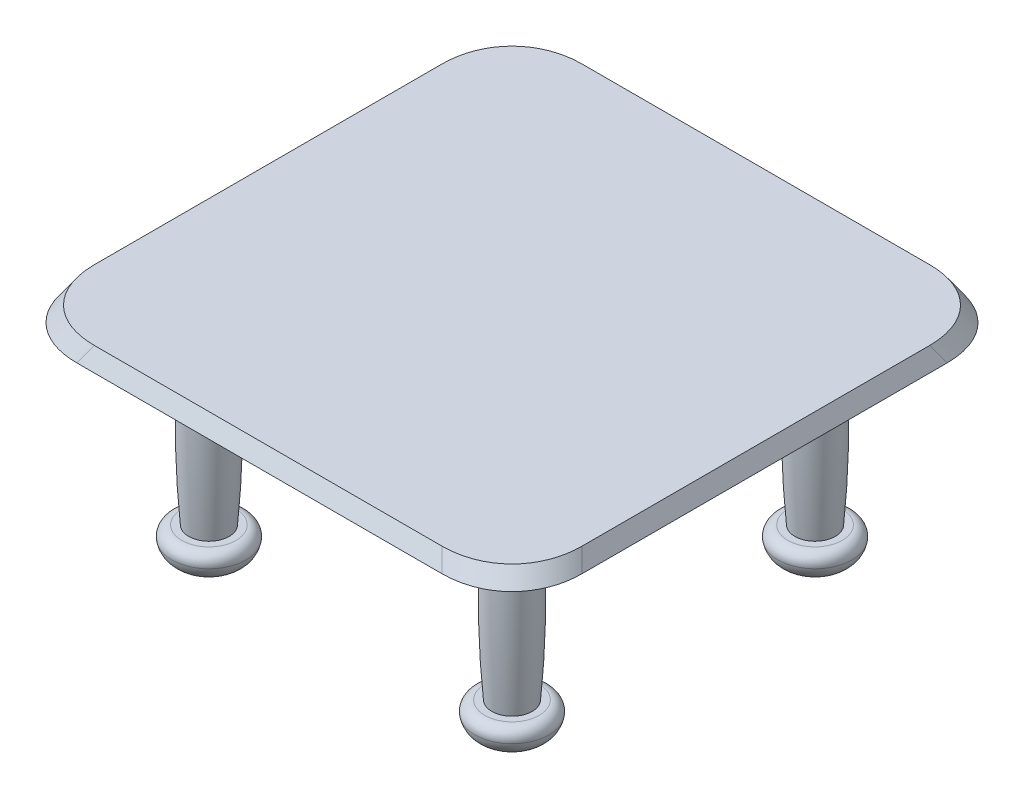
ISO-10303-21;
HEADER;
FILE_DESCRIPTION(('STEP AP214'),'2;1');
FILE_NAME('part.step','',(''),(''),'','','');
FILE_SCHEMA(('AUTOMOTIVE_DESIGN { 1 0 10303 214 1 1 1 1 }'));
ENDSEC;
DATA;
#1=APPLICATION_CONTEXT('core data for automotive mechanical design processes');
#2=APPLICATION_PROTOCOL_DEFINITION('international standard','automotive_design',2000,#1);
#3=PRODUCT_CONTEXT('',#1,'mechanical');
#4=PRODUCT('Part','Part','',(#3));
#5=PRODUCT_RELATED_PRODUCT_CATEGORY('part','',(#4));
#6=PRODUCT_DEFINITION_FORMATION('','',#4);
#7=PRODUCT_DEFINITION_CONTEXT('part definition',#1,'design');
#8=PRODUCT_DEFINITION('design','',#6,#7);
#9=PRODUCT_DEFINITION_SHAPE('','',#8);
#10=(LENGTH_UNIT() NAMED_UNIT(*) SI_UNIT(.MILLI.,.METRE.));
#11=(NAMED_UNIT(*) PLANE_ANGLE_UNIT() SI_UNIT($,.RADIAN.));
#12=(NAMED_UNIT(*) SI_UNIT($,.STERADIAN.) SOLID_ANGLE_UNIT());
#13=UNCERTAINTY_MEASURE_WITH_UNIT(LENGTH_MEASURE(1.E-05),#10,'distance_accuracy_value','');
#14=(GEOMETRIC_REPRESENTATION_CONTEXT(3) GLOBAL_UNCERTAINTY_ASSIGNED_CONTEXT((#13)) GLOBAL_UNIT_ASSIGNED_CONTEXT((#10,
#11,#12)) REPRESENTATION_CONTEXT('',''));
#15=CARTESIAN_POINT('',(0.,0.,0.));
#16=DIRECTION('',(0.,0.,1.));
#17=DIRECTION('',(1.,0.,0.));
#18=AXIS2_PLACEMENT_3D('',#15,#16,#17);
#19=CARTESIAN_POINT('',(0.,0.,0.));
#20=DIRECTION('',(0.,1.,0.));
#21=DIRECTION('',(-1.,0.,0.));
#22=AXIS2_PLACEMENT_3D('',#19,#20,#21);
#23=PLANE('',#22);
#24=CARTESIAN_POINT('',(0.,0.,0.));
#25=DIRECTION('',(0.,1.,0.));
#26=DIRECTION('',(-1.,0.,0.));
#27=AXIS2_PLACEMENT_3D('',#24,#25,#26);
#28=CIRCLE('',#27,25.);
#29=CARTESIAN_POINT('',(-25.,0.,0.));
#30=VERTEX_POINT('',#29);
#31=EDGE_CURVE('E154',#30,#30,#28,.T.);
#32=ORIENTED_EDGE('',*,*,#31,.F.);
#33=EDGE_LOOP('',(#32));
#34=FACE_BOUND('',#33,.T.);
#35=ADVANCED_FACE('F35',(#34),#23,.F.);
#36=CARTESIAN_POINT('',(0.,18.4567183832333,0.));
#37=DIRECTION('',(0.,1.,0.));
#38=DIRECTION('',(-1.,0.,0.));
#39=AXIS2_PLACEMENT_3D('',#36,#37,#38);
#40=DEGENERATE_TOROIDAL_SURFACE('',#39,16.8315143178365,20.1835232756249,.T.);
#41=CARTESIAN_POINT('',(0.,14.8266965466674,0.));
#42=DIRECTION('',(0.,1.,0.));
#43=DIRECTION('',(-1.,0.,0.));
#44=AXIS2_PLACEMENT_3D('',#41,#42,#43);
#45=CIRCLE('',#44,36.6859232308147);
#46=CARTESIAN_POINT('',(-36.6859232308147,14.8266965466674,0.));
#47=VERTEX_POINT('',#46);
#48=EDGE_CURVE('E160',#47,#47,#45,.F.);
#49=ORIENTED_EDGE('',*,*,#48,.T.);
#50=EDGE_LOOP('',(#49));
#51=FACE_BOUND('',#50,.T.);
#52=ORIENTED_EDGE('',*,*,#31,.T.);
#53=EDGE_LOOP('',(#52));
#54=FACE_BOUND('',#53,.T.);
#55=ADVANCED_FACE('F217',(#51,#54),#40,.T.);
#56=CARTESIAN_POINT('',(35.2882327010699,26.6252040653967,0.));
#57=DIRECTION('',(0.,-1.,0.));
#58=DIRECTION('',(1.,0.,0.));
#59=AXIS2_PLACEMENT_3D('',#56,#57,#58);
#60=PLANE('',#59);
#61=CARTESIAN_POINT('',(0.,26.6252040653967,0.));
#62=DIRECTION('',(0.,-1.,0.));
#63=DIRECTION('',(1.,0.,0.));
#64=AXIS2_PLACEMENT_3D('',#61,#62,#63);
#65=CIRCLE('',#64,26.8489841385424);
#66=CARTESIAN_POINT('',(26.8489841385424,26.6252040653967,0.));
#67=VERTEX_POINT('',#66);
#68=EDGE_CURVE('E157',#67,#67,#65,.F.);
#69=ORIENTED_EDGE('',*,*,#68,.T.);
#70=EDGE_LOOP('',(#69));
#71=FACE_BOUND('',#70,.T.);
#72=CARTESIAN_POINT('',(0.,26.6252040653967,0.));
#73=DIRECTION('',(0.,1.,0.));
#74=DIRECTION('',(-1.,0.,0.));
#75=AXIS2_PLACEMENT_3D('',#72,#73,#74);
#76=CIRCLE('',#75,20.);
#77=CARTESIAN_POINT('',(-20.,26.6252040653967,0.));
#78=VERTEX_POINT('',#77);
#79=EDGE_CURVE('E151',#78,#78,#76,.T.);
#80=ORIENTED_EDGE('',*,*,#79,.F.);
#81=EDGE_LOOP('',(#80));
#82=FACE_BOUND('',#81,.T.);
#83=ADVANCED_FACE('F223',(#71,#82),#60,.F.);
#84=CARTESIAN_POINT('',(0.,113.312602032698,0.));
#85=DIRECTION('',(0.,1.,0.));
#86=DIRECTION('',(-1.,0.,0.));
#87=AXIS2_PLACEMENT_3D('',#84,#85,#86);
#88=DEGENERATE_TOROIDAL_SURFACE('',#87,1034.42785391668,1057.98525702473,.F.);
#89=CARTESIAN_POINT('',(0.,200.,0.));
#90=DIRECTION('',(0.,1.,0.));
#91=DIRECTION('',(-1.,0.,0.));
#92=AXIS2_PLACEMENT_3D('',#89,#90,#91);
#93=CIRCLE('',#92,20.);
#94=CARTESIAN_POINT('',(-20.,200.,0.));
#95=VERTEX_POINT('',#94);
#96=EDGE_CURVE('E148',#95,#95,#93,.T.);
#97=ORIENTED_EDGE('',*,*,#96,.F.);
#98=EDGE_LOOP('',(#97));
#99=FACE_BOUND('',#98,.T.);
#100=ORIENTED_EDGE('',*,*,#79,.T.);
#101=EDGE_LOOP('',(#100));
#102=FACE_BOUND('',#101,.T.);
#103=ADVANCED_FACE('F232',(#99,#102),#88,.F.);
#104=CARTESIAN_POINT('',(0.,16.6252040653967,0.));
#105=DIRECTION('',(0.,-1.,0.));
#106=DIRECTION('',(1.,0.,0.));
#107=AXIS2_PLACEMENT_3D('',#104,#105,#106);
#108=TOROIDAL_SURFACE('',#107,26.8489841385424,10.);
#109=ORIENTED_EDGE('',*,*,#48,.F.);
#110=EDGE_LOOP('',(#109));
#111=FACE_BOUND('',#110,.T.);
#112=ORIENTED_EDGE('',*,*,#68,.F.);
#113=EDGE_LOOP('',(#112));
#114=FACE_BOUND('',#113,.T.);
#115=ADVANCED_FACE('F229',(#111,#114),#108,.T.);
#116=CARTESIAN_POINT('',(-400.,200.,-400.));
#117=DIRECTION('',(-0.866025403784438,0.500000000000001,0.));
#118=DIRECTION('',(-0.500000000000001,-0.866025403784438,0.));
#119=AXIS2_PLACEMENT_3D('',#116,#117,#118);
#120=PLANE('',#119);
#121=DIRECTION('',(0.,0.,-1.));
#122=VECTOR('',#121,1.);
#123=CARTESIAN_POINT('',(-391.339745962156,215.,-400.));
#124=LINE('',#123,#122);
#125=CARTESIAN_POINT('',(-391.339745962156,215.,-322.057713659401));
#126=VERTEX_POINT('',#125);
#127=CARTESIAN_POINT('',(-391.339745962156,215.,22.0577136594005));
#128=VERTEX_POINT('',#127);
#129=EDGE_CURVE('E120',#126,#128,#124,.F.);
#130=ORIENTED_EDGE('',*,*,#129,.F.);
#131=DIRECTION('',(0.447213595499959,0.774596669241483,0.447213595499959));
#132=VECTOR('',#131,1.);
#133=CARTESIAN_POINT('',(-413.856406460551,176.,-344.574374157796));
#134=LINE('',#133,#132);
#135=CARTESIAN_POINT('',(-400.,200.,-330.717967697245));
#136=VERTEX_POINT('',#135);
#137=EDGE_CURVE('E104',#126,#136,#134,.F.);
#138=ORIENTED_EDGE('',*,*,#137,.T.);
#139=DIRECTION('',(0.,0.,1.));
#140=VECTOR('',#139,1.);
#141=CARTESIAN_POINT('',(-400.,200.,-400.));
#142=LINE('',#141,#140);
#143=CARTESIAN_POINT('',(-400.,200.,30.7179676972449));
#144=VERTEX_POINT('',#143);
#145=EDGE_CURVE('E117',#136,#144,#142,.T.);
#146=ORIENTED_EDGE('',*,*,#145,.T.);
#147=DIRECTION('',(0.447213595499959,0.774596669241483,-0.447213595499959));
#148=VECTOR('',#147,1.);
#149=CARTESIAN_POINT('',(-313.856406460551,349.205080756888,-55.4256258422043));
#150=LINE('',#149,#148);
#151=EDGE_CURVE('E122',#144,#128,#150,.T.);
#152=ORIENTED_EDGE('',*,*,#151,.T.);
#153=EDGE_LOOP('',(#130,#138,#146,#152));
#154=FACE_BOUND('',#153,.T.);
#155=ADVANCED_FACE('F116',(#154),#120,.T.);
#156=CARTESIAN_POINT('',(-400.,200.,100.));
#157=DIRECTION('',(0.,0.500000000000001,0.866025403784438));
#158=DIRECTION('',(0.,-0.866025403784438,0.500000000000001));
#159=AXIS2_PLACEMENT_3D('',#156,#157,#158);
#160=PLANE('',#159);
#161=DIRECTION('',(-1.,0.,0.));
#162=VECTOR('',#161,1.);
#163=CARTESIAN_POINT('',(-400.,215.,91.3397459621556));
#164=LINE('',#163,#162);
#165=CARTESIAN_POINT('',(-322.057713659401,215.,91.3397459621556));
#166=VERTEX_POINT('',#165);
#167=CARTESIAN_POINT('',(22.0577136594006,215.,91.3397459621556));
#168=VERTEX_POINT('',#167);
#169=EDGE_CURVE('E141',#166,#168,#164,.F.);
#170=ORIENTED_EDGE('',*,*,#169,.F.);
#171=DIRECTION('',(0.447213595499959,0.774596669241483,-0.447213595499959));
#172=VECTOR('',#171,1.);
#173=CARTESIAN_POINT('',(-344.574374157796,176.,113.856406460551));
#174=LINE('',#173,#172);
#175=CARTESIAN_POINT('',(-330.717967697245,200.,100.));
#176=VERTEX_POINT('',#175);
#177=EDGE_CURVE('E189',#166,#176,#174,.F.);
#178=ORIENTED_EDGE('',*,*,#177,.T.);
#179=DIRECTION('',(1.,0.,0.));
#180=VECTOR('',#179,1.);
#181=CARTESIAN_POINT('',(-400.,200.,100.));
#182=LINE('',#181,#180);
#183=CARTESIAN_POINT('',(30.717967697245,200.,100.));
#184=VERTEX_POINT('',#183);
#185=EDGE_CURVE('E126',#176,#184,#182,.T.);
#186=ORIENTED_EDGE('',*,*,#185,.T.);
#187=DIRECTION('',(-0.447213595499959,0.774596669241483,-0.447213595499959));
#188=VECTOR('',#187,1.);
#189=CARTESIAN_POINT('',(-55.4256258422043,349.205080756888,13.8564064605507));
#190=LINE('',#189,#188);
#191=EDGE_CURVE('E187',#184,#168,#190,.T.);
#192=ORIENTED_EDGE('',*,*,#191,.T.);
#193=EDGE_LOOP('',(#170,#178,#186,#192));
#194=FACE_BOUND('',#193,.T.);
#195=ADVANCED_FACE('F210',(#194),#160,.T.);
#196=CARTESIAN_POINT('',(100.,200.,-400.));
#197=DIRECTION('',(0.866025403784438,0.500000000000001,0.));
#198=DIRECTION('',(-0.500000000000001,0.866025403784438,0.));
#199=AXIS2_PLACEMENT_3D('',#196,#197,#198);
#200=PLANE('',#199);
#201=DIRECTION('',(0.,0.,-1.));
#202=VECTOR('',#201,1.);
#203=CARTESIAN_POINT('',(100.,200.,-400.));
#204=LINE('',#203,#202);
#205=CARTESIAN_POINT('',(100.,200.,30.7179676972449));
#206=VERTEX_POINT('',#205);
#207=CARTESIAN_POINT('',(100.,200.,-330.717967697245));
#208=VERTEX_POINT('',#207);
#209=EDGE_CURVE('E130',#206,#208,#204,.T.);
#210=ORIENTED_EDGE('',*,*,#209,.T.);
#211=DIRECTION('',(-0.447213595499959,0.774596669241483,0.447213595499959));
#212=VECTOR('',#211,1.);
#213=CARTESIAN_POINT('',(113.856406460551,176.,-344.574374157796));
#214=LINE('',#213,#212);
#215=CARTESIAN_POINT('',(91.3397459621556,215.,-322.057713659401));
#216=VERTEX_POINT('',#215);
#217=EDGE_CURVE('E11',#208,#216,#214,.T.);
#218=ORIENTED_EDGE('',*,*,#217,.T.);
#219=DIRECTION('',(0.,0.,1.));
#220=VECTOR('',#219,1.);
#221=CARTESIAN_POINT('',(91.3397459621556,215.,-400.));
#222=LINE('',#221,#220);
#223=CARTESIAN_POINT('',(91.3397459621556,215.,22.0577136594005));
#224=VERTEX_POINT('',#223);
#225=EDGE_CURVE('E143',#224,#216,#222,.F.);
#226=ORIENTED_EDGE('',*,*,#225,.F.);
#227=DIRECTION('',(-0.447213595499959,0.774596669241483,-0.447213595499959));
#228=VECTOR('',#227,1.);
#229=CARTESIAN_POINT('',(13.8564064605507,349.205080756888,-55.4256258422043));
#230=LINE('',#229,#228);
#231=EDGE_CURVE('E43',#224,#206,#230,.F.);
#232=ORIENTED_EDGE('',*,*,#231,.T.);
#233=EDGE_LOOP('',(#210,#218,#226,#232));
#234=FACE_BOUND('',#233,.T.);
#235=ADVANCED_FACE('F194',(#234),#200,.T.);
#236=CARTESIAN_POINT('',(-400.,200.,-400.));
#237=DIRECTION('',(0.,0.500000000000001,-0.866025403784438));
#238=DIRECTION('',(0.,0.866025403784438,0.500000000000001));
#239=AXIS2_PLACEMENT_3D('',#236,#237,#238);
#240=PLANE('',#239);
#241=DIRECTION('',(-1.,0.,0.));
#242=VECTOR('',#241,1.);
#243=CARTESIAN_POINT('',(-400.,200.,-400.));
#244=LINE('',#243,#242);
#245=CARTESIAN_POINT('',(30.717967697245,200.,-400.));
#246=VERTEX_POINT('',#245);
#247=CARTESIAN_POINT('',(-330.717967697245,200.,-400.));
#248=VERTEX_POINT('',#247);
#249=EDGE_CURVE('E138',#246,#248,#244,.T.);
#250=ORIENTED_EDGE('',*,*,#249,.T.);
#251=DIRECTION('',(0.447213595499959,0.774596669241483,0.447213595499959));
#252=VECTOR('',#251,1.);
#253=CARTESIAN_POINT('',(-344.574374157796,176.,-413.856406460551));
#254=LINE('',#253,#252);
#255=CARTESIAN_POINT('',(-322.057713659401,215.,-391.339745962156));
#256=VERTEX_POINT('',#255);
#257=EDGE_CURVE('E105',#248,#256,#254,.T.);
#258=ORIENTED_EDGE('',*,*,#257,.T.);
#259=DIRECTION('',(1.,0.,0.));
#260=VECTOR('',#259,1.);
#261=CARTESIAN_POINT('',(-400.,215.,-391.339745962156));
#262=LINE('',#261,#260);
#263=CARTESIAN_POINT('',(22.0577136594006,215.,-391.339745962156));
#264=VERTEX_POINT('',#263);
#265=EDGE_CURVE('E145',#264,#256,#262,.F.);
#266=ORIENTED_EDGE('',*,*,#265,.F.);
#267=DIRECTION('',(-0.447213595499959,0.774596669241483,0.447213595499959));
#268=VECTOR('',#267,1.);
#269=CARTESIAN_POINT('',(-55.4256258422043,349.205080756888,-313.856406460551));
#270=LINE('',#269,#268);
#271=EDGE_CURVE('E110',#264,#246,#270,.F.);
#272=ORIENTED_EDGE('',*,*,#271,.T.);
#273=EDGE_LOOP('',(#250,#258,#266,#272));
#274=FACE_BOUND('',#273,.T.);
#275=ADVANCED_FACE('F202',(#274),#240,.T.);
#276=CARTESIAN_POINT('',(0.,215.,0.));
#277=DIRECTION('',(0.,1.,0.));
#278=DIRECTION('',(0.,0.,1.));
#279=AXIS2_PLACEMENT_3D('',#276,#277,#278);
#280=PLANE('',#279);
#281=ORIENTED_EDGE('',*,*,#265,.T.);
#282=CARTESIAN_POINT('',(-298.963702891815,215.,-298.963702891815));
#283=DIRECTION('',(0.,1.,0.));
#284=DIRECTION('',(-0.707106781186548,0.,-0.707106781186548));
#285=AXIS2_PLACEMENT_3D('',#282,#283,#284);
#286=ELLIPSE('',#285,103.279555898865,80.);
#287=EDGE_CURVE('E185',#256,#126,#286,.T.);
#288=ORIENTED_EDGE('',*,*,#287,.T.);
#289=ORIENTED_EDGE('',*,*,#129,.T.);
#290=CARTESIAN_POINT('',(-298.963702891815,215.,-1.03629710818461));
#291=DIRECTION('',(0.,1.,0.));
#292=DIRECTION('',(-0.707106781186547,0.,0.707106781186548));
#293=AXIS2_PLACEMENT_3D('',#290,#291,#292);
#294=ELLIPSE('',#293,103.279555898865,80.);
#295=EDGE_CURVE('E183',#128,#166,#294,.T.);
#296=ORIENTED_EDGE('',*,*,#295,.T.);
#297=ORIENTED_EDGE('',*,*,#169,.T.);
#298=CARTESIAN_POINT('',(-1.03629710818456,215.,-1.0362971081846));
#299=DIRECTION('',(0.,1.,0.));
#300=DIRECTION('',(0.707106781186548,0.,0.707106781186548));
#301=AXIS2_PLACEMENT_3D('',#298,#299,#300);
#302=ELLIPSE('',#301,103.279555898865,80.);
#303=EDGE_CURVE('E55',#168,#224,#302,.T.);
#304=ORIENTED_EDGE('',*,*,#303,.T.);
#305=ORIENTED_EDGE('',*,*,#225,.T.);
#306=CARTESIAN_POINT('',(-1.0362971081846,215.,-298.963702891815));
#307=DIRECTION('',(0.,1.,0.));
#308=DIRECTION('',(0.707106781186547,0.,-0.707106781186548));
#309=AXIS2_PLACEMENT_3D('',#306,#307,#308);
#310=ELLIPSE('',#309,103.279555898865,80.);
#311=EDGE_CURVE('E181',#216,#264,#310,.T.);
#312=ORIENTED_EDGE('',*,*,#311,.T.);
#313=EDGE_LOOP('',(#281,#288,#289,#296,#297,#304,#305,#312));
#314=FACE_BOUND('',#313,.T.);
#315=ADVANCED_FACE('F203',(#314),#280,.T.);
#316=CARTESIAN_POINT('',(0.,200.,0.));
#317=DIRECTION('',(0.,1.,0.));
#318=DIRECTION('',(0.,0.,1.));
#319=AXIS2_PLACEMENT_3D('',#316,#317,#318);
#320=PLANE('',#319);
#321=CARTESIAN_POINT('',(-300.,200.,0.));
#322=DIRECTION('',(0.,1.,0.));
#323=DIRECTION('',(0.,0.,1.));
#324=AXIS2_PLACEMENT_3D('',#321,#322,#323);
#325=CIRCLE('',#324,20.);
#326=CARTESIAN_POINT('',(-300.,200.,20.));
#327=VERTEX_POINT('',#326);
#328=EDGE_CURVE('E169',#327,#327,#325,.F.);
#329=ORIENTED_EDGE('',*,*,#328,.F.);
#330=EDGE_LOOP('',(#329));
#331=FACE_BOUND('',#330,.T.);
#332=CARTESIAN_POINT('',(-300.,200.,-300.));
#333=DIRECTION('',(0.,1.,0.));
#334=DIRECTION('',(0.,0.,1.));
#335=AXIS2_PLACEMENT_3D('',#332,#333,#334);
#336=CIRCLE('',#335,20.);
#337=CARTESIAN_POINT('',(-300.,200.,-280.));
#338=VERTEX_POINT('',#337);
#339=EDGE_CURVE('E166',#338,#338,#336,.F.);
#340=ORIENTED_EDGE('',*,*,#339,.F.);
#341=EDGE_LOOP('',(#340));
#342=FACE_BOUND('',#341,.T.);
#343=CARTESIAN_POINT('',(0.,200.,-300.));
#344=DIRECTION('',(0.,1.,0.));
#345=DIRECTION('',(0.,0.,1.));
#346=AXIS2_PLACEMENT_3D('',#343,#344,#345);
#347=CIRCLE('',#346,20.);
#348=CARTESIAN_POINT('',(0.,200.,-280.));
#349=VERTEX_POINT('',#348);
#350=EDGE_CURVE('E163',#349,#349,#347,.F.);
#351=ORIENTED_EDGE('',*,*,#350,.F.);
#352=EDGE_LOOP('',(#351));
#353=FACE_BOUND('',#352,.T.);
#354=ORIENTED_EDGE('',*,*,#96,.T.);
#355=EDGE_LOOP('',(#354));
#356=FACE_BOUND('',#355,.T.);
#357=ORIENTED_EDGE('',*,*,#145,.F.);
#358=CARTESIAN_POINT('',(-307.62395692966,200.,-307.62395692966));
#359=DIRECTION('',(0.,1.,0.));
#360=DIRECTION('',(-0.707106781186548,0.,-0.707106781186548));
#361=AXIS2_PLACEMENT_3D('',#358,#359,#360);
#362=ELLIPSE('',#361,103.279555898865,80.);
#363=EDGE_CURVE('E100',#136,#248,#362,.F.);
#364=ORIENTED_EDGE('',*,*,#363,.T.);
#365=ORIENTED_EDGE('',*,*,#249,.F.);
#366=CARTESIAN_POINT('',(7.62395692965982,200.,-307.62395692966));
#367=DIRECTION('',(0.,1.,0.));
#368=DIRECTION('',(0.707106781186547,0.,-0.707106781186548));
#369=AXIS2_PLACEMENT_3D('',#366,#367,#368);
#370=ELLIPSE('',#369,103.279555898865,80.);
#371=EDGE_CURVE('E174',#246,#208,#370,.F.);
#372=ORIENTED_EDGE('',*,*,#371,.T.);
#373=ORIENTED_EDGE('',*,*,#209,.F.);
#374=CARTESIAN_POINT('',(7.62395692965985,200.,7.62395692965981));
#375=DIRECTION('',(0.,1.,0.));
#376=DIRECTION('',(0.707106781186548,0.,0.707106781186548));
#377=AXIS2_PLACEMENT_3D('',#374,#375,#376);
#378=ELLIPSE('',#377,103.279555898865,80.);
#379=EDGE_CURVE('E121',#206,#184,#378,.F.);
#380=ORIENTED_EDGE('',*,*,#379,.T.);
#381=ORIENTED_EDGE('',*,*,#185,.F.);
#382=CARTESIAN_POINT('',(-307.62395692966,200.,7.62395692965981));
#383=DIRECTION('',(0.,1.,0.));
#384=DIRECTION('',(-0.707106781186547,0.,0.707106781186548));
#385=AXIS2_PLACEMENT_3D('',#382,#383,#384);
#386=ELLIPSE('',#385,103.279555898865,80.);
#387=EDGE_CURVE('E111',#176,#144,#386,.F.);
#388=ORIENTED_EDGE('',*,*,#387,.T.);
#389=EDGE_LOOP('',(#357,#364,#365,#372,#373,#380,#381,#388));
#390=FACE_BOUND('',#389,.T.);
#391=ADVANCED_FACE('F124',(#331,#342,#353,#356,#390),#320,.F.);
#392=CARTESIAN_POINT('',(0.,0.,-300.));
#393=DIRECTION('',(0.,1.,0.));
#394=DIRECTION('',(-1.,0.,0.));
#395=AXIS2_PLACEMENT_3D('',#392,#393,#394);
#396=PLANE('',#395);
#397=CARTESIAN_POINT('',(0.,0.,-300.));
#398=DIRECTION('',(0.,1.,0.));
#399=DIRECTION('',(-1.,0.,0.));
#400=AXIS2_PLACEMENT_3D('',#397,#398,#399);
#401=CIRCLE('',#400,25.);
#402=CARTESIAN_POINT('',(-25.,0.,-300.));
#403=VERTEX_POINT('',#402);
#404=EDGE_CURVE('E510',#403,#403,#401,.T.);
#405=ORIENTED_EDGE('',*,*,#404,.F.);
#406=EDGE_LOOP('',(#405));
#407=FACE_BOUND('',#406,.T.);
#408=ADVANCED_FACE('F267',(#407),#396,.F.);
#409=CARTESIAN_POINT('',(0.,18.4567183832333,-300.));
#410=DIRECTION('',(0.,1.,0.));
#411=DIRECTION('',(-1.,0.,0.));
#412=AXIS2_PLACEMENT_3D('',#409,#410,#411);
#413=DEGENERATE_TOROIDAL_SURFACE('',#412,16.8315143178365,20.1835232756249,.T.);
#414=CARTESIAN_POINT('',(0.,14.8266965466674,-300.));
#415=DIRECTION('',(0.,1.,0.));
#416=DIRECTION('',(-1.,0.,0.));
#417=AXIS2_PLACEMENT_3D('',#414,#415,#416);
#418=CIRCLE('',#417,36.6859232308147);
#419=CARTESIAN_POINT('',(-36.6859232308147,14.8266965466674,-300.));
#420=VERTEX_POINT('',#419);
#421=EDGE_CURVE('E127',#420,#420,#418,.F.);
#422=ORIENTED_EDGE('',*,*,#421,.T.);
#423=EDGE_LOOP('',(#422));
#424=FACE_BOUND('',#423,.T.);
#425=ORIENTED_EDGE('',*,*,#404,.T.);
#426=EDGE_LOOP('',(#425));
#427=FACE_BOUND('',#426,.T.);
#428=ADVANCED_FACE('F423',(#424,#427),#413,.T.);
#429=CARTESIAN_POINT('',(35.2882327010699,26.6252040653967,-300.));
#430=DIRECTION('',(0.,-1.,0.));
#431=DIRECTION('',(1.,0.,0.));
#432=AXIS2_PLACEMENT_3D('',#429,#430,#431);
#433=PLANE('',#432);
#434=CARTESIAN_POINT('',(0.,26.6252040653967,-300.));
#435=DIRECTION('',(0.,-1.,0.));
#436=DIRECTION('',(1.,0.,0.));
#437=AXIS2_PLACEMENT_3D('',#434,#435,#436);
#438=CIRCLE('',#437,26.8489841385424);
#439=CARTESIAN_POINT('',(26.8489841385424,26.6252040653967,-300.));
#440=VERTEX_POINT('',#439);
#441=EDGE_CURVE('E133',#440,#440,#438,.F.);
#442=ORIENTED_EDGE('',*,*,#441,.T.);
#443=EDGE_LOOP('',(#442));
#444=FACE_BOUND('',#443,.T.);
#445=CARTESIAN_POINT('',(0.,26.6252040653967,-300.));
#446=DIRECTION('',(0.,1.,0.));
#447=DIRECTION('',(-1.,0.,0.));
#448=AXIS2_PLACEMENT_3D('',#445,#446,#447);
#449=CIRCLE('',#448,20.);
#450=CARTESIAN_POINT('',(-20.,26.6252040653967,-300.));
#451=VERTEX_POINT('',#450);
#452=EDGE_CURVE('E512',#451,#451,#449,.T.);
#453=ORIENTED_EDGE('',*,*,#452,.F.);
#454=EDGE_LOOP('',(#453));
#455=FACE_BOUND('',#454,.T.);
#456=ADVANCED_FACE('F414',(#444,#455),#433,.F.);
#457=CARTESIAN_POINT('',(0.,113.312602032698,-300.));
#458=DIRECTION('',(0.,1.,0.));
#459=DIRECTION('',(-1.,0.,0.));
#460=AXIS2_PLACEMENT_3D('',#457,#458,#459);
#461=DEGENERATE_TOROIDAL_SURFACE('',#460,1034.42785391668,1057.98525702473,.F.);
#462=ORIENTED_EDGE('',*,*,#350,.T.);
#463=EDGE_LOOP('',(#462));
#464=FACE_BOUND('',#463,.T.);
#465=ORIENTED_EDGE('',*,*,#452,.T.);
#466=EDGE_LOOP('',(#465));
#467=FACE_BOUND('',#466,.T.);
#468=ADVANCED_FACE('F405',(#464,#467),#461,.F.);
#469=CARTESIAN_POINT('',(0.,16.6252040653967,-300.));
#470=DIRECTION('',(0.,-1.,0.));
#471=DIRECTION('',(1.,0.,0.));
#472=AXIS2_PLACEMENT_3D('',#469,#470,#471);
#473=TOROIDAL_SURFACE('',#472,26.8489841385424,10.);
#474=ORIENTED_EDGE('',*,*,#421,.F.);
#475=EDGE_LOOP('',(#474));
#476=FACE_BOUND('',#475,.T.);
#477=ORIENTED_EDGE('',*,*,#441,.F.);
#478=EDGE_LOOP('',(#477));
#479=FACE_BOUND('',#478,.T.);
#480=ADVANCED_FACE('F395',(#476,#479),#473,.T.);
#481=CARTESIAN_POINT('',(-300.,0.,-300.));
#482=DIRECTION('',(0.,1.,0.));
#483=DIRECTION('',(-1.,0.,0.));
#484=AXIS2_PLACEMENT_3D('',#481,#482,#483);
#485=PLANE('',#484);
#486=CARTESIAN_POINT('',(-300.,0.,-300.));
#487=DIRECTION('',(0.,1.,0.));
#488=DIRECTION('',(-1.,0.,0.));
#489=AXIS2_PLACEMENT_3D('',#486,#487,#488);
#490=CIRCLE('',#489,25.);
#491=CARTESIAN_POINT('',(-325.,0.,-300.));
#492=VERTEX_POINT('',#491);
#493=EDGE_CURVE('E524',#492,#492,#490,.T.);
#494=ORIENTED_EDGE('',*,*,#493,.F.);
#495=EDGE_LOOP('',(#494));
#496=FACE_BOUND('',#495,.T.);
#497=ADVANCED_FACE('F385',(#496),#485,.F.);
#498=CARTESIAN_POINT('',(-300.,18.4567183832333,-300.));
#499=DIRECTION('',(0.,1.,0.));
#500=DIRECTION('',(-1.,0.,0.));
#501=AXIS2_PLACEMENT_3D('',#498,#499,#500);
#502=DEGENERATE_TOROIDAL_SURFACE('',#501,16.8315143178365,20.1835232756249,.T.);
#503=CARTESIAN_POINT('',(-300.,14.8266965466674,-300.));
#504=DIRECTION('',(0.,1.,0.));
#505=DIRECTION('',(-1.,0.,0.));
#506=AXIS2_PLACEMENT_3D('',#503,#504,#505);
#507=CIRCLE('',#506,36.6859232308147);
#508=CARTESIAN_POINT('',(-336.685923230815,14.8266965466674,-300.));
#509=VERTEX_POINT('',#508);
#510=EDGE_CURVE('E516',#509,#509,#507,.F.);
#511=ORIENTED_EDGE('',*,*,#510,.T.);
#512=EDGE_LOOP('',(#511));
#513=FACE_BOUND('',#512,.T.);
#514=ORIENTED_EDGE('',*,*,#493,.T.);
#515=EDGE_LOOP('',(#514));
#516=FACE_BOUND('',#515,.T.);
#517=ADVANCED_FACE('F375',(#513,#516),#502,.T.);
#518=CARTESIAN_POINT('',(-264.71176729893,26.6252040653967,-300.));
#519=DIRECTION('',(0.,-1.,0.));
#520=DIRECTION('',(1.,0.,0.));
#521=AXIS2_PLACEMENT_3D('',#518,#519,#520);
#522=PLANE('',#521);
#523=CARTESIAN_POINT('',(-300.,26.6252040653967,-300.));
#524=DIRECTION('',(0.,-1.,0.));
#525=DIRECTION('',(1.,0.,0.));
#526=AXIS2_PLACEMENT_3D('',#523,#524,#525);
#527=CIRCLE('',#526,26.8489841385424);
#528=CARTESIAN_POINT('',(-273.151015861457,26.6252040653967,-300.));
#529=VERTEX_POINT('',#528);
#530=EDGE_CURVE('E521',#529,#529,#527,.F.);
#531=ORIENTED_EDGE('',*,*,#530,.T.);
#532=EDGE_LOOP('',(#531));
#533=FACE_BOUND('',#532,.T.);
#534=CARTESIAN_POINT('',(-300.,26.6252040653967,-300.));
#535=DIRECTION('',(0.,1.,0.));
#536=DIRECTION('',(-1.,0.,0.));
#537=AXIS2_PLACEMENT_3D('',#534,#535,#536);
#538=CIRCLE('',#537,20.);
#539=CARTESIAN_POINT('',(-320.,26.6252040653967,-300.));
#540=VERTEX_POINT('',#539);
#541=EDGE_CURVE('E527',#540,#540,#538,.T.);
#542=ORIENTED_EDGE('',*,*,#541,.F.);
#543=EDGE_LOOP('',(#542));
#544=FACE_BOUND('',#543,.T.);
#545=ADVANCED_FACE('F365',(#533,#544),#522,.F.);
#546=CARTESIAN_POINT('',(-300.,113.312602032698,-300.));
#547=DIRECTION('',(0.,1.,0.));
#548=DIRECTION('',(-1.,0.,0.));
#549=AXIS2_PLACEMENT_3D('',#546,#547,#548);
#550=DEGENERATE_TOROIDAL_SURFACE('',#549,1034.42785391668,1057.98525702473,.F.);
#551=ORIENTED_EDGE('',*,*,#339,.T.);
#552=EDGE_LOOP('',(#551));
#553=FACE_BOUND('',#552,.T.);
#554=ORIENTED_EDGE('',*,*,#541,.T.);
#555=EDGE_LOOP('',(#554));
#556=FACE_BOUND('',#555,.T.);
#557=ADVANCED_FACE('F355',(#553,#556),#550,.F.);
#558=CARTESIAN_POINT('',(-300.,16.6252040653967,-300.));
#559=DIRECTION('',(0.,-1.,0.));
#560=DIRECTION('',(1.,0.,0.));
#561=AXIS2_PLACEMENT_3D('',#558,#559,#560);
#562=TOROIDAL_SURFACE('',#561,26.8489841385424,10.);
#563=ORIENTED_EDGE('',*,*,#510,.F.);
#564=EDGE_LOOP('',(#563));
#565=FACE_BOUND('',#564,.T.);
#566=ORIENTED_EDGE('',*,*,#530,.F.);
#567=EDGE_LOOP('',(#566));
#568=FACE_BOUND('',#567,.T.);
#569=ADVANCED_FACE('F346',(#565,#568),#562,.T.);
#570=CARTESIAN_POINT('',(-300.,0.,0.));
#571=DIRECTION('',(0.,1.,0.));
#572=DIRECTION('',(-1.,0.,0.));
#573=AXIS2_PLACEMENT_3D('',#570,#571,#572);
#574=PLANE('',#573);
#575=CARTESIAN_POINT('',(-300.,0.,0.));
#576=DIRECTION('',(0.,1.,0.));
#577=DIRECTION('',(-1.,0.,0.));
#578=AXIS2_PLACEMENT_3D('',#575,#576,#577);
#579=CIRCLE('',#578,25.);
#580=CARTESIAN_POINT('',(-325.,0.,0.));
#581=VERTEX_POINT('',#580);
#582=EDGE_CURVE('E536',#581,#581,#579,.T.);
#583=ORIENTED_EDGE('',*,*,#582,.F.);
#584=EDGE_LOOP('',(#583));
#585=FACE_BOUND('',#584,.T.);
#586=ADVANCED_FACE('F337',(#585),#574,.F.);
#587=CARTESIAN_POINT('',(-300.,18.4567183832333,0.));
#588=DIRECTION('',(0.,1.,0.));
#589=DIRECTION('',(-1.,0.,0.));
#590=AXIS2_PLACEMENT_3D('',#587,#588,#589);
#591=DEGENERATE_TOROIDAL_SURFACE('',#590,16.8315143178365,20.1835232756249,.T.);
#592=CARTESIAN_POINT('',(-300.,14.8266965466674,0.));
#593=DIRECTION('',(0.,1.,0.));
#594=DIRECTION('',(-1.,0.,0.));
#595=AXIS2_PLACEMENT_3D('',#592,#593,#594);
#596=CIRCLE('',#595,36.6859232308147);
#597=CARTESIAN_POINT('',(-336.685923230815,14.8266965466674,0.));
#598=VERTEX_POINT('',#597);
#599=EDGE_CURVE('E530',#598,#598,#596,.F.);
#600=ORIENTED_EDGE('',*,*,#599,.T.);
#601=EDGE_LOOP('',(#600));
#602=FACE_BOUND('',#601,.T.);
#603=ORIENTED_EDGE('',*,*,#582,.T.);
#604=EDGE_LOOP('',(#603));
#605=FACE_BOUND('',#604,.T.);
#606=ADVANCED_FACE('F328',(#602,#605),#591,.T.);
#607=CARTESIAN_POINT('',(-264.71176729893,26.6252040653967,0.));
#608=DIRECTION('',(0.,-1.,0.));
#609=DIRECTION('',(1.,0.,0.));
#610=AXIS2_PLACEMENT_3D('',#607,#608,#609);
#611=PLANE('',#610);
#612=CARTESIAN_POINT('',(-300.,26.6252040653967,0.));
#613=DIRECTION('',(0.,-1.,0.));
#614=DIRECTION('',(1.,0.,0.));
#615=AXIS2_PLACEMENT_3D('',#612,#613,#614);
#616=CIRCLE('',#615,26.8489841385424);
#617=CARTESIAN_POINT('',(-273.151015861457,26.6252040653967,0.));
#618=VERTEX_POINT('',#617);
#619=EDGE_CURVE('E533',#618,#618,#616,.F.);
#620=ORIENTED_EDGE('',*,*,#619,.T.);
#621=EDGE_LOOP('',(#620));
#622=FACE_BOUND('',#621,.T.);
#623=CARTESIAN_POINT('',(-300.,26.6252040653967,0.));
#624=DIRECTION('',(0.,1.,0.));
#625=DIRECTION('',(-1.,0.,0.));
#626=AXIS2_PLACEMENT_3D('',#623,#624,#625);
#627=CIRCLE('',#626,20.);
#628=CARTESIAN_POINT('',(-320.,26.6252040653967,0.));
#629=VERTEX_POINT('',#628);
#630=EDGE_CURVE('E539',#629,#629,#627,.T.);
#631=ORIENTED_EDGE('',*,*,#630,.F.);
#632=EDGE_LOOP('',(#631));
#633=FACE_BOUND('',#632,.T.);
#634=ADVANCED_FACE('F319',(#622,#633),#611,.F.);
#635=CARTESIAN_POINT('',(-300.,113.312602032698,0.));
#636=DIRECTION('',(0.,1.,0.));
#637=DIRECTION('',(-1.,0.,0.));
#638=AXIS2_PLACEMENT_3D('',#635,#636,#637);
#639=DEGENERATE_TOROIDAL_SURFACE('',#638,1034.42785391668,1057.98525702473,.F.);
#640=ORIENTED_EDGE('',*,*,#328,.T.);
#641=EDGE_LOOP('',(#640));
#642=FACE_BOUND('',#641,.T.);
#643=ORIENTED_EDGE('',*,*,#630,.T.);
#644=EDGE_LOOP('',(#643));
#645=FACE_BOUND('',#644,.T.);
#646=ADVANCED_FACE('F310',(#642,#645),#639,.F.);
#647=CARTESIAN_POINT('',(-300.,16.6252040653967,0.));
#648=DIRECTION('',(0.,-1.,0.));
#649=DIRECTION('',(1.,0.,0.));
#650=AXIS2_PLACEMENT_3D('',#647,#648,#649);
#651=TOROIDAL_SURFACE('',#650,26.8489841385424,10.);
#652=ORIENTED_EDGE('',*,*,#599,.F.);
#653=EDGE_LOOP('',(#652));
#654=FACE_BOUND('',#653,.T.);
#655=ORIENTED_EDGE('',*,*,#619,.F.);
#656=EDGE_LOOP('',(#655));
#657=FACE_BOUND('',#656,.T.);
#658=ADVANCED_FACE('F236',(#654,#657),#651,.T.);
#659=CARTESIAN_POINT('',(-344.574374157796,136.,-344.574374157796));
#660=DIRECTION('',(-0.447213595499959,-0.774596669241482,-0.447213595499959));
#661=DIRECTION('',(0.866025403784438,-0.500000000000001,0.));
#662=AXIS2_PLACEMENT_3D('',#659,#660,#661);
#663=CYLINDRICAL_SURFACE('',#662,80.);
#664=ORIENTED_EDGE('',*,*,#287,.F.);
#665=ORIENTED_EDGE('',*,*,#257,.F.);
#666=ORIENTED_EDGE('',*,*,#363,.F.);
#667=ORIENTED_EDGE('',*,*,#137,.F.);
#668=EDGE_LOOP('',(#664,#665,#666,#667));
#669=FACE_BOUND('',#668,.T.);
#670=ADVANCED_FACE('F103',(#669),#663,.T.);
#671=CARTESIAN_POINT('',(-344.574374157796,136.,44.574374157796));
#672=DIRECTION('',(-0.447213595499958,-0.774596669241482,0.447213595499959));
#673=DIRECTION('',(0.,-0.500000000000001,-0.866025403784438));
#674=AXIS2_PLACEMENT_3D('',#671,#672,#673);
#675=CYLINDRICAL_SURFACE('',#674,80.);
#676=ORIENTED_EDGE('',*,*,#295,.F.);
#677=ORIENTED_EDGE('',*,*,#151,.F.);
#678=ORIENTED_EDGE('',*,*,#387,.F.);
#679=ORIENTED_EDGE('',*,*,#177,.F.);
#680=EDGE_LOOP('',(#676,#677,#678,#679));
#681=FACE_BOUND('',#680,.T.);
#682=ADVANCED_FACE('F208',(#681),#675,.T.);
#683=CARTESIAN_POINT('',(-55.4256258422043,309.205080756888,-244.574374157796));
#684=DIRECTION('',(0.447213595499958,-0.774596669241482,-0.447213595499959));
#685=DIRECTION('',(0.,0.500000000000001,-0.866025403784438));
#686=AXIS2_PLACEMENT_3D('',#683,#684,#685);
#687=CYLINDRICAL_SURFACE('',#686,80.);
#688=ORIENTED_EDGE('',*,*,#311,.F.);
#689=ORIENTED_EDGE('',*,*,#217,.F.);
#690=ORIENTED_EDGE('',*,*,#371,.F.);
#691=ORIENTED_EDGE('',*,*,#271,.F.);
#692=EDGE_LOOP('',(#688,#689,#690,#691));
#693=FACE_BOUND('',#692,.T.);
#694=ADVANCED_FACE('F199',(#693),#687,.T.);
#695=CARTESIAN_POINT('',(-55.4256258422043,309.205080756888,-55.4256258422043));
#696=DIRECTION('',(0.447213595499959,-0.774596669241482,0.447213595499959));
#697=DIRECTION('',(0.866025403784438,0.500000000000001,0.));
#698=AXIS2_PLACEMENT_3D('',#695,#696,#697);
#699=CYLINDRICAL_SURFACE('',#698,80.);
#700=ORIENTED_EDGE('',*,*,#303,.F.);
#701=ORIENTED_EDGE('',*,*,#191,.F.);
#702=ORIENTED_EDGE('',*,*,#379,.F.);
#703=ORIENTED_EDGE('',*,*,#231,.F.);
#704=EDGE_LOOP('',(#700,#701,#702,#703));
#705=FACE_BOUND('',#704,.T.);
#706=ADVANCED_FACE('F37',(#705),#699,.T.);
#707=CLOSED_SHELL('',(#35,#55,#83,#103,#115,#155,#195,#235,#275,#315,#391,#408,#428,#456,#468,
#480,#497,#517,#545,#557,#569,#586,#606,#634,#646,#658,#670,#682,#694,#706));
#708=MANIFOLD_SOLID_BREP('B2',#707);
#709=ADVANCED_BREP_SHAPE_REPRESENTATION('',(#18,#708),#14);
#710=SHAPE_DEFINITION_REPRESENTATION(#9,#709);
ENDSEC;
END-ISO-10303-21;
